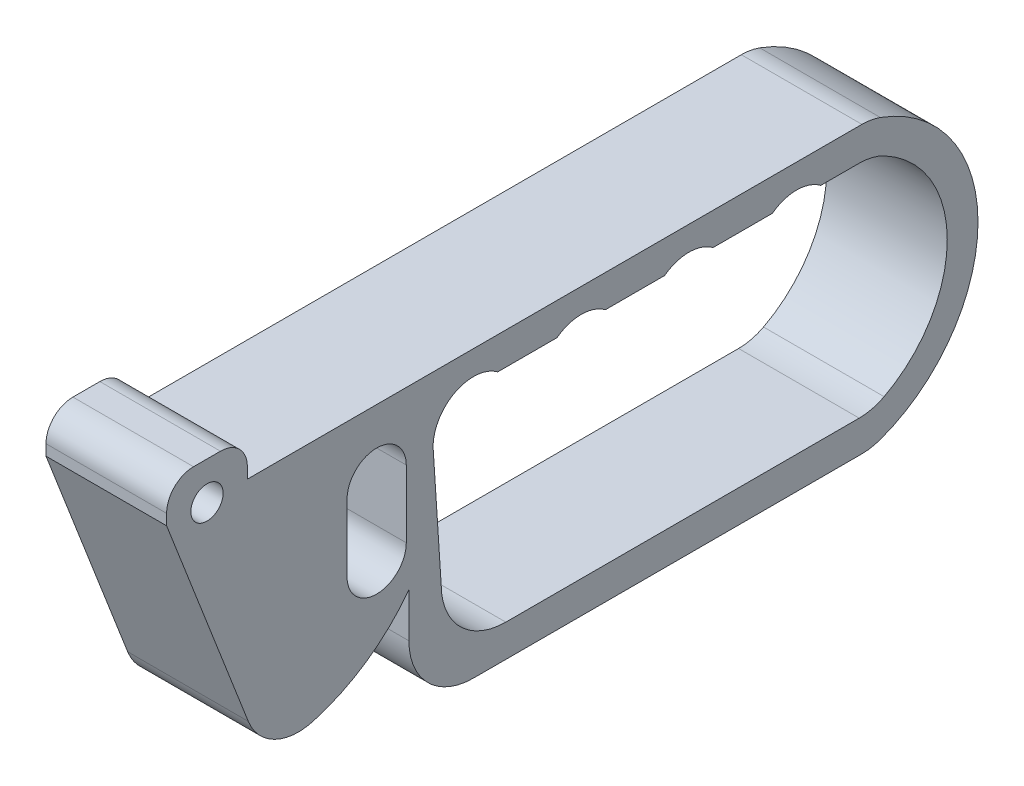
ISO-10303-21;
HEADER;
FILE_DESCRIPTION(('STEP AP214'),'2;1');
FILE_NAME('part.step','',(''),(''),'','','');
FILE_SCHEMA(('AUTOMOTIVE_DESIGN { 1 0 10303 214 1 1 1 1 }'));
ENDSEC;
DATA;
#1=APPLICATION_CONTEXT('core data for automotive mechanical design processes');
#2=APPLICATION_PROTOCOL_DEFINITION('international standard','automotive_design',2000,#1);
#3=PRODUCT_CONTEXT('',#1,'mechanical');
#4=PRODUCT('Part','Part','',(#3));
#5=PRODUCT_RELATED_PRODUCT_CATEGORY('part','',(#4));
#6=PRODUCT_DEFINITION_FORMATION('','',#4);
#7=PRODUCT_DEFINITION_CONTEXT('part definition',#1,'design');
#8=PRODUCT_DEFINITION('design','',#6,#7);
#9=PRODUCT_DEFINITION_SHAPE('','',#8);
#10=(LENGTH_UNIT() NAMED_UNIT(*) SI_UNIT(.MILLI.,.METRE.));
#11=(NAMED_UNIT(*) PLANE_ANGLE_UNIT() SI_UNIT($,.RADIAN.));
#12=(NAMED_UNIT(*) SI_UNIT($,.STERADIAN.) SOLID_ANGLE_UNIT());
#13=UNCERTAINTY_MEASURE_WITH_UNIT(LENGTH_MEASURE(1.E-05),#10,'distance_accuracy_value','');
#14=(GEOMETRIC_REPRESENTATION_CONTEXT(3) GLOBAL_UNCERTAINTY_ASSIGNED_CONTEXT((#13)) GLOBAL_UNIT_ASSIGNED_CONTEXT((#10,
#11,#12)) REPRESENTATION_CONTEXT('',''));
#15=CARTESIAN_POINT('',(0.,0.,0.));
#16=DIRECTION('',(0.,0.,1.));
#17=DIRECTION('',(1.,0.,0.));
#18=AXIS2_PLACEMENT_3D('',#15,#16,#17);
#19=CARTESIAN_POINT('',(-11.2,-14.5,40.85));
#20=DIRECTION('',(1.,0.,0.));
#21=DIRECTION('',(0.,0.,-1.));
#22=AXIS2_PLACEMENT_3D('',#19,#20,#21);
#23=PLANE('',#22);
#24=CARTESIAN_POINT('',(-11.2,26.5,90.35));
#25=DIRECTION('',(1.,0.,0.));
#26=DIRECTION('',(0.,0.,-1.));
#27=AXIS2_PLACEMENT_3D('',#24,#25,#26);
#28=CIRCLE('',#27,3.00000000000001);
#29=CARTESIAN_POINT('',(-11.2,26.5,87.35));
#30=VERTEX_POINT('',#29);
#31=EDGE_CURVE('E986',#30,#30,#28,.F.);
#32=ORIENTED_EDGE('',*,*,#31,.F.);
#33=EDGE_LOOP('',(#32));
#34=FACE_BOUND('',#33,.T.);
#35=DIRECTION('',(0.,0.997833989659183,0.0657824374802129));
#36=VECTOR('',#35,1.);
#37=CARTESIAN_POINT('',(-11.2,-8.50000000000008,46.85));
#38=LINE('',#37,#36);
#39=CARTESIAN_POINT('',(-11.2,-8.50000000000008,46.85));
#40=VERTEX_POINT('',#39);
#41=CARTESIAN_POINT('',(-11.2,14.0066317188984,48.3337549224439));
#42=VERTEX_POINT('',#41);
#43=EDGE_CURVE('E313',#40,#42,#38,.T.);
#44=ORIENTED_EDGE('',*,*,#43,.F.);
#45=CARTESIAN_POINT('',(-11.2,-8.5,34.85));
#46=DIRECTION('',(1.,0.,0.));
#47=DIRECTION('',(0.,0.,-1.));
#48=AXIS2_PLACEMENT_3D('',#45,#46,#47);
#49=CIRCLE('',#48,12.);
#50=CARTESIAN_POINT('',(-11.2,-20.5,34.8499999999999));
#51=VERTEX_POINT('',#50);
#52=EDGE_CURVE('E423',#40,#51,#49,.T.);
#53=ORIENTED_EDGE('',*,*,#52,.T.);
#54=DIRECTION('',(0.,0.,-1.));
#55=VECTOR('',#54,1.);
#56=CARTESIAN_POINT('',(-11.2,-20.5,34.8499999999999));
#57=LINE('',#56,#55);
#58=CARTESIAN_POINT('',(-11.2,-20.5,-30.7829674795884));
#59=VERTEX_POINT('',#58);
#60=EDGE_CURVE('E427',#51,#59,#57,.T.);
#61=ORIENTED_EDGE('',*,*,#60,.T.);
#62=CARTESIAN_POINT('',(-11.2,-10.5,-30.7829674795884));
#63=DIRECTION('',(1.,0.,0.));
#64=DIRECTION('',(0.,0.,-1.));
#65=AXIS2_PLACEMENT_3D('',#62,#63,#64);
#66=CIRCLE('',#65,10.);
#67=CARTESIAN_POINT('',(-11.2,-19.3620530720667,-35.4158947775149));
#68=VERTEX_POINT('',#67);
#69=EDGE_CURVE('E489',#59,#68,#66,.T.);
#70=ORIENTED_EDGE('',*,*,#69,.T.);
#71=CARTESIAN_POINT('',(-11.2,0.,-25.29375));
#72=DIRECTION('',(1.,0.,0.));
#73=DIRECTION('',(0.,0.,1.));
#74=AXIS2_PLACEMENT_3D('',#71,#72,#73);
#75=CIRCLE('',#74,21.8482702762141);
#76=CARTESIAN_POINT('',(-11.2,19.3620530720667,-35.4158947775149));
#77=VERTEX_POINT('',#76);
#78=EDGE_CURVE('E418',#68,#77,#75,.T.);
#79=ORIENTED_EDGE('',*,*,#78,.T.);
#80=CARTESIAN_POINT('',(-11.2,10.5,-30.7829674795884));
#81=DIRECTION('',(1.,0.,0.));
#82=DIRECTION('',(0.,0.,-1.));
#83=AXIS2_PLACEMENT_3D('',#80,#81,#82);
#84=CIRCLE('',#83,10.);
#85=CARTESIAN_POINT('',(-11.2,20.5,-30.7829674795884));
#86=VERTEX_POINT('',#85);
#87=EDGE_CURVE('E462',#77,#86,#84,.T.);
#88=ORIENTED_EDGE('',*,*,#87,.T.);
#89=DIRECTION('',(0.,0.,1.));
#90=VECTOR('',#89,1.);
#91=CARTESIAN_POINT('',(-11.2,20.5,-32.85));
#92=LINE('',#91,#90);
#93=CARTESIAN_POINT('',(-11.2,20.5,-23.65));
#94=VERTEX_POINT('',#93);
#95=EDGE_CURVE('E421',#86,#94,#92,.T.);
#96=ORIENTED_EDGE('',*,*,#95,.T.);
#97=CARTESIAN_POINT('',(-11.2,14.5,-19.15));
#98=DIRECTION('',(1.,0.,0.));
#99=DIRECTION('',(0.,0.,-1.));
#100=AXIS2_PLACEMENT_3D('',#97,#98,#99);
#101=CIRCLE('',#100,7.5);
#102=CARTESIAN_POINT('',(-11.2,20.5,-14.65));
#103=VERTEX_POINT('',#102);
#104=EDGE_CURVE('E352',#103,#94,#101,.F.);
#105=ORIENTED_EDGE('',*,*,#104,.F.);
#106=CARTESIAN_POINT('',(-11.2,20.5,-3.65));
#107=VERTEX_POINT('',#106);
#108=EDGE_CURVE('E424',#103,#107,#92,.T.);
#109=ORIENTED_EDGE('',*,*,#108,.T.);
#110=CARTESIAN_POINT('',(-11.2,14.5,0.84999999999999));
#111=DIRECTION('',(1.,0.,0.));
#112=DIRECTION('',(0.,0.,-1.));
#113=AXIS2_PLACEMENT_3D('',#110,#111,#112);
#114=CIRCLE('',#113,7.5);
#115=CARTESIAN_POINT('',(-11.2,20.5,5.34999999999998));
#116=VERTEX_POINT('',#115);
#117=EDGE_CURVE('E366',#116,#107,#114,.F.);
#118=ORIENTED_EDGE('',*,*,#117,.F.);
#119=CARTESIAN_POINT('',(-11.2,20.5,16.35));
#120=VERTEX_POINT('',#119);
#121=EDGE_CURVE('E682',#116,#120,#92,.T.);
#122=ORIENTED_EDGE('',*,*,#121,.T.);
#123=CARTESIAN_POINT('',(-11.2,14.5,20.85));
#124=DIRECTION('',(1.,0.,0.));
#125=DIRECTION('',(0.,0.,-1.));
#126=AXIS2_PLACEMENT_3D('',#123,#124,#125);
#127=CIRCLE('',#126,7.5);
#128=CARTESIAN_POINT('',(-11.2,20.5,25.35));
#129=VERTEX_POINT('',#128);
#130=EDGE_CURVE('E362',#129,#120,#127,.F.);
#131=ORIENTED_EDGE('',*,*,#130,.F.);
#132=CARTESIAN_POINT('',(-11.2,20.5,36.35));
#133=VERTEX_POINT('',#132);
#134=EDGE_CURVE('E420',#129,#133,#92,.T.);
#135=ORIENTED_EDGE('',*,*,#134,.T.);
#136=CARTESIAN_POINT('',(-11.2,14.5,40.85));
#137=DIRECTION('',(1.,0.,0.));
#138=DIRECTION('',(0.,0.,-1.));
#139=AXIS2_PLACEMENT_3D('',#136,#137,#138);
#140=CIRCLE('',#139,7.5);
#141=EDGE_CURVE('E358',#42,#133,#140,.F.);
#142=ORIENTED_EDGE('',*,*,#141,.F.);
#143=EDGE_LOOP('',(#44,#53,#61,#70,#79,#88,#96,#105,#109,#118,#122,#131,#135,#142));
#144=FACE_BOUND('',#143,.T.);
#145=CARTESIAN_POINT('',(-11.2,13.8770572321374,79.85));
#146=DIRECTION('',(1.,0.,0.));
#147=DIRECTION('',(0.,0.,-1.));
#148=AXIS2_PLACEMENT_3D('',#145,#146,#147);
#149=CIRCLE('',#148,33.7062848523677);
#150=CARTESIAN_POINT('',(-11.2,-6.3,52.85));
#151=VERTEX_POINT('',#150);
#152=CARTESIAN_POINT('',(-11.2,-18.5411037952664,70.6208898505726));
#153=VERTEX_POINT('',#152);
#154=EDGE_CURVE('E304',#151,#153,#149,.F.);
#155=ORIENTED_EDGE('',*,*,#154,.T.);
#156=CARTESIAN_POINT('',(-11.2,-8.92326511343182,73.3589875643523));
#157=DIRECTION('',(1.,0.,0.));
#158=DIRECTION('',(0.,0.,-1.));
#159=AXIS2_PLACEMENT_3D('',#156,#157,#158);
#160=CIRCLE('',#159,10.);
#161=CARTESIAN_POINT('',(-11.2,-12.5447702064899,82.6801838856918));
#162=VERTEX_POINT('',#161);
#163=EDGE_CURVE('E494',#153,#162,#160,.F.);
#164=ORIENTED_EDGE('',*,*,#163,.T.);
#165=DIRECTION('',(0.,0.932119632133956,0.362150509305811));
#166=VECTOR('',#165,1.);
#167=CARTESIAN_POINT('',(-11.2,-19.8292276202303,79.85));
#168=LINE('',#167,#166);
#169=CARTESIAN_POINT('',(-11.2,26.5,97.85));
#170=VERTEX_POINT('',#169);
#171=EDGE_CURVE('E302',#162,#170,#168,.T.);
#172=ORIENTED_EDGE('',*,*,#171,.T.);
#173=DIRECTION('',(0.,1.,0.));
#174=VECTOR('',#173,1.);
#175=CARTESIAN_POINT('',(-11.2,26.5,97.85));
#176=LINE('',#175,#174);
#177=CARTESIAN_POINT('',(-11.2,28.5,97.85));
#178=VERTEX_POINT('',#177);
#179=EDGE_CURVE('E299',#170,#178,#176,.T.);
#180=ORIENTED_EDGE('',*,*,#179,.T.);
#181=CARTESIAN_POINT('',(-11.2,28.5,92.85));
#182=DIRECTION('',(1.,0.,0.));
#183=DIRECTION('',(0.,0.,-1.));
#184=AXIS2_PLACEMENT_3D('',#181,#182,#183);
#185=CIRCLE('',#184,5.);
#186=CARTESIAN_POINT('',(-11.2,33.5,92.85));
#187=VERTEX_POINT('',#186);
#188=EDGE_CURVE('E296',#178,#187,#185,.F.);
#189=ORIENTED_EDGE('',*,*,#188,.T.);
#190=DIRECTION('',(0.,0.,-1.));
#191=VECTOR('',#190,1.);
#192=CARTESIAN_POINT('',(-11.2,33.5,92.85));
#193=LINE('',#192,#191);
#194=CARTESIAN_POINT('',(-11.2,33.5,87.85));
#195=VERTEX_POINT('',#194);
#196=EDGE_CURVE('E293',#187,#195,#193,.T.);
#197=ORIENTED_EDGE('',*,*,#196,.T.);
#198=CARTESIAN_POINT('',(-11.2,28.5,87.85));
#199=DIRECTION('',(1.,0.,0.));
#200=DIRECTION('',(0.,0.,-1.));
#201=AXIS2_PLACEMENT_3D('',#198,#199,#200);
#202=CIRCLE('',#201,5.);
#203=CARTESIAN_POINT('',(-11.2,28.5,82.85));
#204=VERTEX_POINT('',#203);
#205=EDGE_CURVE('E281',#195,#204,#202,.F.);
#206=ORIENTED_EDGE('',*,*,#205,.T.);
#207=DIRECTION('',(0.,-1.,0.));
#208=VECTOR('',#207,1.);
#209=CARTESIAN_POINT('',(-11.2,26.5,82.85));
#210=LINE('',#209,#208);
#211=CARTESIAN_POINT('',(-11.2,26.5,82.85));
#212=VERTEX_POINT('',#211);
#213=EDGE_CURVE('E307',#204,#212,#210,.T.);
#214=ORIENTED_EDGE('',*,*,#213,.T.);
#215=DIRECTION('',(0.,0.,1.));
#216=VECTOR('',#215,1.);
#217=CARTESIAN_POINT('',(-11.2,26.5,52.85));
#218=LINE('',#217,#216);
#219=CARTESIAN_POINT('',(-11.2,26.5,-31.2914090485372));
#220=VERTEX_POINT('',#219);
#221=EDGE_CURVE('E446',#220,#212,#218,.T.);
#222=ORIENTED_EDGE('',*,*,#221,.F.);
#223=CARTESIAN_POINT('',(-11.2,16.5,-31.2914090485372));
#224=DIRECTION('',(1.,0.,0.));
#225=DIRECTION('',(0.,0.,-1.));
#226=AXIS2_PLACEMENT_3D('',#223,#224,#225);
#227=CIRCLE('',#226,10.);
#228=CARTESIAN_POINT('',(-11.2,25.8983624065504,-34.7076619775723));
#229=VERTEX_POINT('',#228);
#230=EDGE_CURVE('E481',#220,#229,#227,.F.);
#231=ORIENTED_EDGE('',*,*,#230,.T.);
#232=CARTESIAN_POINT('',(-11.2,0.,-25.29375));
#233=DIRECTION('',(1.,0.,0.));
#234=DIRECTION('',(0.,0.,1.));
#235=AXIS2_PLACEMENT_3D('',#232,#233,#234);
#236=CIRCLE('',#235,27.55625);
#237=CARTESIAN_POINT('',(-11.2,-25.8983624065504,-34.7076619775723));
#238=VERTEX_POINT('',#237);
#239=EDGE_CURVE('E443',#238,#229,#236,.T.);
#240=ORIENTED_EDGE('',*,*,#239,.F.);
#241=CARTESIAN_POINT('',(-11.2,-16.5,-31.2914090485372));
#242=DIRECTION('',(1.,0.,0.));
#243=DIRECTION('',(0.,0.,-1.));
#244=AXIS2_PLACEMENT_3D('',#241,#242,#243);
#245=CIRCLE('',#244,10.);
#246=CARTESIAN_POINT('',(-11.2,-26.5,-31.2914090485372));
#247=VERTEX_POINT('',#246);
#248=EDGE_CURVE('E483',#238,#247,#245,.F.);
#249=ORIENTED_EDGE('',*,*,#248,.T.);
#250=DIRECTION('',(0.,0.,-1.));
#251=VECTOR('',#250,1.);
#252=CARTESIAN_POINT('',(-11.2,-26.5,40.8499999999999));
#253=LINE('',#252,#251);
#254=CARTESIAN_POINT('',(-11.2,-26.5,40.8499999999999));
#255=VERTEX_POINT('',#254);
#256=EDGE_CURVE('E440',#255,#247,#253,.T.);
#257=ORIENTED_EDGE('',*,*,#256,.F.);
#258=CARTESIAN_POINT('',(-11.2,-14.5,40.85));
#259=DIRECTION('',(1.,0.,0.));
#260=DIRECTION('',(0.,0.,-1.));
#261=AXIS2_PLACEMENT_3D('',#258,#259,#260);
#262=CIRCLE('',#261,12.);
#263=CARTESIAN_POINT('',(-11.2,-14.4999999999999,52.85));
#264=VERTEX_POINT('',#263);
#265=EDGE_CURVE('E437',#264,#255,#262,.T.);
#266=ORIENTED_EDGE('',*,*,#265,.F.);
#267=DIRECTION('',(0.,-1.,0.));
#268=VECTOR('',#267,1.);
#269=CARTESIAN_POINT('',(-11.2,26.5,52.85));
#270=LINE('',#269,#268);
#271=EDGE_CURVE('E433',#151,#264,#270,.T.);
#272=ORIENTED_EDGE('',*,*,#271,.F.);
#273=EDGE_LOOP('',(#155,#164,#172,#180,#189,#197,#206,#214,#222,#231,#240,#249,#257,#266,#272));
#274=FACE_BOUND('',#273,.T.);
#275=CARTESIAN_POINT('',(-11.2,14.0066317188984,58.8337549224439));
#276=DIRECTION('',(1.,0.,0.));
#277=DIRECTION('',(0.,0.,-1.));
#278=AXIS2_PLACEMENT_3D('',#275,#276,#277);
#279=CIRCLE('',#278,5.5);
#280=CARTESIAN_POINT('',(-11.2,14.0066317188984,64.3337549224438));
#281=VERTEX_POINT('',#280);
#282=CARTESIAN_POINT('',(-11.2,14.0066317188984,53.3337549224439));
#283=VERTEX_POINT('',#282);
#284=EDGE_CURVE('E56',#281,#283,#279,.F.);
#285=ORIENTED_EDGE('',*,*,#284,.F.);
#286=DIRECTION('',(0.,1.,0.));
#287=VECTOR('',#286,1.);
#288=CARTESIAN_POINT('',(-11.2,14.0066317188984,64.3337549224438));
#289=LINE('',#288,#287);
#290=CARTESIAN_POINT('',(-11.2,1.50663171889838,64.3337549224438));
#291=VERTEX_POINT('',#290);
#292=EDGE_CURVE('E259',#291,#281,#289,.T.);
#293=ORIENTED_EDGE('',*,*,#292,.F.);
#294=CARTESIAN_POINT('',(-11.2,1.50663171889838,58.8337549224439));
#295=DIRECTION('',(1.,0.,0.));
#296=DIRECTION('',(0.,0.,-1.));
#297=AXIS2_PLACEMENT_3D('',#294,#295,#296);
#298=CIRCLE('',#297,5.5);
#299=CARTESIAN_POINT('',(-11.2,1.50663171889838,53.3337549224439));
#300=VERTEX_POINT('',#299);
#301=EDGE_CURVE('E266',#300,#291,#298,.F.);
#302=ORIENTED_EDGE('',*,*,#301,.F.);
#303=DIRECTION('',(0.,-1.,0.));
#304=VECTOR('',#303,1.);
#305=CARTESIAN_POINT('',(-11.2,14.0066317188984,53.3337549224439));
#306=LINE('',#305,#304);
#307=EDGE_CURVE('E271',#283,#300,#306,.T.);
#308=ORIENTED_EDGE('',*,*,#307,.F.);
#309=EDGE_LOOP('',(#285,#293,#302,#308));
#310=FACE_BOUND('',#309,.T.);
#311=ADVANCED_FACE('F41',(#34,#144,#274,#310),#23,.F.);
#312=CARTESIAN_POINT('',(11.2,-14.5,40.85));
#313=DIRECTION('',(1.,0.,0.));
#314=DIRECTION('',(0.,0.,-1.));
#315=AXIS2_PLACEMENT_3D('',#312,#313,#314);
#316=PLANE('',#315);
#317=CARTESIAN_POINT('',(11.2,26.5,90.35));
#318=DIRECTION('',(1.,0.,0.));
#319=DIRECTION('',(0.,0.,-1.));
#320=AXIS2_PLACEMENT_3D('',#317,#318,#319);
#321=CIRCLE('',#320,3.00000000000001);
#322=CARTESIAN_POINT('',(11.2,26.5,87.35));
#323=VERTEX_POINT('',#322);
#324=EDGE_CURVE('E272',#323,#323,#321,.T.);
#325=ORIENTED_EDGE('',*,*,#324,.F.);
#326=EDGE_LOOP('',(#325));
#327=FACE_BOUND('',#326,.T.);
#328=DIRECTION('',(0.,-0.932119632133956,-0.362150509305811));
#329=VECTOR('',#328,1.);
#330=CARTESIAN_POINT('',(11.2,-19.8292276202303,79.85));
#331=LINE('',#330,#329);
#332=CARTESIAN_POINT('',(11.2,26.5,97.85));
#333=VERTEX_POINT('',#332);
#334=CARTESIAN_POINT('',(11.2,-12.5447702064899,82.6801838856918));
#335=VERTEX_POINT('',#334);
#336=EDGE_CURVE('E314',#333,#335,#331,.T.);
#337=ORIENTED_EDGE('',*,*,#336,.T.);
#338=CARTESIAN_POINT('',(11.2,-8.92326511343182,73.3589875643523));
#339=DIRECTION('',(1.,0.,0.));
#340=DIRECTION('',(0.,0.,-1.));
#341=AXIS2_PLACEMENT_3D('',#338,#339,#340);
#342=CIRCLE('',#341,10.);
#343=CARTESIAN_POINT('',(11.2,-18.5411037952664,70.6208898505726));
#344=VERTEX_POINT('',#343);
#345=EDGE_CURVE('E11',#335,#344,#342,.T.);
#346=ORIENTED_EDGE('',*,*,#345,.T.);
#347=CARTESIAN_POINT('',(11.2,13.8770572321374,79.85));
#348=DIRECTION('',(1.,0.,0.));
#349=DIRECTION('',(0.,0.,-1.));
#350=AXIS2_PLACEMENT_3D('',#347,#348,#349);
#351=CIRCLE('',#350,33.7062848523677);
#352=CARTESIAN_POINT('',(11.2,-6.3,52.85));
#353=VERTEX_POINT('',#352);
#354=EDGE_CURVE('E311',#344,#353,#351,.T.);
#355=ORIENTED_EDGE('',*,*,#354,.T.);
#356=DIRECTION('',(0.,-1.,0.));
#357=VECTOR('',#356,1.);
#358=CARTESIAN_POINT('',(11.2,26.5,52.85));
#359=LINE('',#358,#357);
#360=CARTESIAN_POINT('',(11.2,-14.4999999999999,52.85));
#361=VERTEX_POINT('',#360);
#362=EDGE_CURVE('E405',#353,#361,#359,.T.);
#363=ORIENTED_EDGE('',*,*,#362,.T.);
#364=CARTESIAN_POINT('',(11.2,-14.5,40.85));
#365=DIRECTION('',(1.,0.,0.));
#366=DIRECTION('',(0.,0.,-1.));
#367=AXIS2_PLACEMENT_3D('',#364,#365,#366);
#368=CIRCLE('',#367,12.);
#369=CARTESIAN_POINT('',(11.2,-26.5,40.8499999999999));
#370=VERTEX_POINT('',#369);
#371=EDGE_CURVE('E407',#361,#370,#368,.T.);
#372=ORIENTED_EDGE('',*,*,#371,.T.);
#373=DIRECTION('',(0.,0.,-1.));
#374=VECTOR('',#373,1.);
#375=CARTESIAN_POINT('',(11.2,-26.5,40.8499999999999));
#376=LINE('',#375,#374);
#377=CARTESIAN_POINT('',(11.2,-26.5,-31.2914090485372));
#378=VERTEX_POINT('',#377);
#379=EDGE_CURVE('E410',#370,#378,#376,.T.);
#380=ORIENTED_EDGE('',*,*,#379,.T.);
#381=CARTESIAN_POINT('',(11.2,-16.5,-31.2914090485372));
#382=DIRECTION('',(1.,0.,0.));
#383=DIRECTION('',(0.,0.,-1.));
#384=AXIS2_PLACEMENT_3D('',#381,#382,#383);
#385=CIRCLE('',#384,10.);
#386=CARTESIAN_POINT('',(11.2,-25.8983624065504,-34.7076619775723));
#387=VERTEX_POINT('',#386);
#388=EDGE_CURVE('E474',#378,#387,#385,.T.);
#389=ORIENTED_EDGE('',*,*,#388,.T.);
#390=CARTESIAN_POINT('',(11.2,0.,-25.29375));
#391=DIRECTION('',(1.,0.,0.));
#392=DIRECTION('',(0.,0.,1.));
#393=AXIS2_PLACEMENT_3D('',#390,#391,#392);
#394=CIRCLE('',#393,27.55625);
#395=CARTESIAN_POINT('',(11.2,25.8983624065504,-34.7076619775723));
#396=VERTEX_POINT('',#395);
#397=EDGE_CURVE('E413',#387,#396,#394,.T.);
#398=ORIENTED_EDGE('',*,*,#397,.T.);
#399=CARTESIAN_POINT('',(11.2,16.5,-31.2914090485372));
#400=DIRECTION('',(1.,0.,0.));
#401=DIRECTION('',(0.,0.,-1.));
#402=AXIS2_PLACEMENT_3D('',#399,#400,#401);
#403=CIRCLE('',#402,10.);
#404=CARTESIAN_POINT('',(11.2,26.5,-31.2914090485372));
#405=VERTEX_POINT('',#404);
#406=EDGE_CURVE('E472',#396,#405,#403,.T.);
#407=ORIENTED_EDGE('',*,*,#406,.T.);
#408=DIRECTION('',(0.,0.,1.));
#409=VECTOR('',#408,1.);
#410=CARTESIAN_POINT('',(11.2,26.5,52.85));
#411=LINE('',#410,#409);
#412=CARTESIAN_POINT('',(11.2,26.5,82.85));
#413=VERTEX_POINT('',#412);
#414=EDGE_CURVE('E416',#405,#413,#411,.T.);
#415=ORIENTED_EDGE('',*,*,#414,.T.);
#416=DIRECTION('',(0.,1.,0.));
#417=VECTOR('',#416,1.);
#418=CARTESIAN_POINT('',(11.2,26.5,82.85));
#419=LINE('',#418,#417);
#420=CARTESIAN_POINT('',(11.2,28.5,82.85));
#421=VERTEX_POINT('',#420);
#422=EDGE_CURVE('E329',#413,#421,#419,.T.);
#423=ORIENTED_EDGE('',*,*,#422,.T.);
#424=CARTESIAN_POINT('',(11.2,28.5,87.85));
#425=DIRECTION('',(1.,0.,0.));
#426=DIRECTION('',(0.,0.,-1.));
#427=AXIS2_PLACEMENT_3D('',#424,#425,#426);
#428=CIRCLE('',#427,5.);
#429=CARTESIAN_POINT('',(11.2,33.5,87.85));
#430=VERTEX_POINT('',#429);
#431=EDGE_CURVE('E326',#421,#430,#428,.T.);
#432=ORIENTED_EDGE('',*,*,#431,.T.);
#433=DIRECTION('',(0.,0.,1.));
#434=VECTOR('',#433,1.);
#435=CARTESIAN_POINT('',(11.2,33.5,92.85));
#436=LINE('',#435,#434);
#437=CARTESIAN_POINT('',(11.2,33.5,92.85));
#438=VERTEX_POINT('',#437);
#439=EDGE_CURVE('E323',#430,#438,#436,.T.);
#440=ORIENTED_EDGE('',*,*,#439,.T.);
#441=CARTESIAN_POINT('',(11.2,28.5,92.85));
#442=DIRECTION('',(1.,0.,0.));
#443=DIRECTION('',(0.,0.,-1.));
#444=AXIS2_PLACEMENT_3D('',#441,#442,#443);
#445=CIRCLE('',#444,5.);
#446=CARTESIAN_POINT('',(11.2,28.5,97.85));
#447=VERTEX_POINT('',#446);
#448=EDGE_CURVE('E320',#438,#447,#445,.T.);
#449=ORIENTED_EDGE('',*,*,#448,.T.);
#450=DIRECTION('',(0.,-1.,0.));
#451=VECTOR('',#450,1.);
#452=CARTESIAN_POINT('',(11.2,26.5,97.85));
#453=LINE('',#452,#451);
#454=EDGE_CURVE('E317',#447,#333,#453,.T.);
#455=ORIENTED_EDGE('',*,*,#454,.T.);
#456=EDGE_LOOP('',(#337,#346,#355,#363,#372,#380,#389,#398,#407,#415,#423,#432,#440,#449,#455));
#457=FACE_BOUND('',#456,.T.);
#458=CARTESIAN_POINT('',(11.2,-8.5,34.85));
#459=DIRECTION('',(1.,0.,0.));
#460=DIRECTION('',(0.,0.,-1.));
#461=AXIS2_PLACEMENT_3D('',#458,#459,#460);
#462=CIRCLE('',#461,12.);
#463=CARTESIAN_POINT('',(11.2,-8.50000000000008,46.85));
#464=VERTEX_POINT('',#463);
#465=CARTESIAN_POINT('',(11.2,-20.5,34.8499999999999));
#466=VERTEX_POINT('',#465);
#467=EDGE_CURVE('E398',#464,#466,#462,.T.);
#468=ORIENTED_EDGE('',*,*,#467,.F.);
#469=DIRECTION('',(0.,-0.997833989659183,-0.0657824374802129));
#470=VECTOR('',#469,1.);
#471=CARTESIAN_POINT('',(11.2,-8.50000000000008,46.85));
#472=LINE('',#471,#470);
#473=CARTESIAN_POINT('',(11.2,14.0066317188984,48.3337549224439));
#474=VERTEX_POINT('',#473);
#475=EDGE_CURVE('E350',#474,#464,#472,.T.);
#476=ORIENTED_EDGE('',*,*,#475,.F.);
#477=CARTESIAN_POINT('',(11.2,14.5,40.85));
#478=DIRECTION('',(1.,0.,0.));
#479=DIRECTION('',(0.,0.,-1.));
#480=AXIS2_PLACEMENT_3D('',#477,#478,#479);
#481=CIRCLE('',#480,7.5);
#482=CARTESIAN_POINT('',(11.2,20.5,36.35));
#483=VERTEX_POINT('',#482);
#484=EDGE_CURVE('E355',#483,#474,#481,.T.);
#485=ORIENTED_EDGE('',*,*,#484,.F.);
#486=DIRECTION('',(0.,0.,1.));
#487=VECTOR('',#486,1.);
#488=CARTESIAN_POINT('',(11.2,20.5,-32.85));
#489=LINE('',#488,#487);
#490=CARTESIAN_POINT('',(11.2,20.5,25.35));
#491=VERTEX_POINT('',#490);
#492=EDGE_CURVE('E395',#491,#483,#489,.T.);
#493=ORIENTED_EDGE('',*,*,#492,.F.);
#494=CARTESIAN_POINT('',(11.2,14.5,20.85));
#495=DIRECTION('',(1.,0.,0.));
#496=DIRECTION('',(0.,0.,-1.));
#497=AXIS2_PLACEMENT_3D('',#494,#495,#496);
#498=CIRCLE('',#497,7.5);
#499=CARTESIAN_POINT('',(11.2,20.5,16.35));
#500=VERTEX_POINT('',#499);
#501=EDGE_CURVE('E359',#500,#491,#498,.T.);
#502=ORIENTED_EDGE('',*,*,#501,.F.);
#503=CARTESIAN_POINT('',(11.2,20.5,5.34999999999998));
#504=VERTEX_POINT('',#503);
#505=EDGE_CURVE('E665',#504,#500,#489,.T.);
#506=ORIENTED_EDGE('',*,*,#505,.F.);
#507=CARTESIAN_POINT('',(11.2,14.5,0.84999999999999));
#508=DIRECTION('',(1.,0.,0.));
#509=DIRECTION('',(0.,0.,-1.));
#510=AXIS2_PLACEMENT_3D('',#507,#508,#509);
#511=CIRCLE('',#510,7.5);
#512=CARTESIAN_POINT('',(11.2,20.5,-3.65));
#513=VERTEX_POINT('',#512);
#514=EDGE_CURVE('E364',#513,#504,#511,.T.);
#515=ORIENTED_EDGE('',*,*,#514,.F.);
#516=CARTESIAN_POINT('',(11.2,20.5,-14.65));
#517=VERTEX_POINT('',#516);
#518=EDGE_CURVE('E399',#517,#513,#489,.T.);
#519=ORIENTED_EDGE('',*,*,#518,.F.);
#520=CARTESIAN_POINT('',(11.2,14.5,-19.15));
#521=DIRECTION('',(1.,0.,0.));
#522=DIRECTION('',(0.,0.,-1.));
#523=AXIS2_PLACEMENT_3D('',#520,#521,#522);
#524=CIRCLE('',#523,7.5);
#525=CARTESIAN_POINT('',(11.2,20.5,-23.65));
#526=VERTEX_POINT('',#525);
#527=EDGE_CURVE('E368',#526,#517,#524,.T.);
#528=ORIENTED_EDGE('',*,*,#527,.F.);
#529=CARTESIAN_POINT('',(11.2,20.5,-30.7829674795884));
#530=VERTEX_POINT('',#529);
#531=EDGE_CURVE('E396',#530,#526,#489,.T.);
#532=ORIENTED_EDGE('',*,*,#531,.F.);
#533=CARTESIAN_POINT('',(11.2,10.5,-30.7829674795884));
#534=DIRECTION('',(1.,0.,0.));
#535=DIRECTION('',(0.,0.,-1.));
#536=AXIS2_PLACEMENT_3D('',#533,#534,#535);
#537=CIRCLE('',#536,10.);
#538=CARTESIAN_POINT('',(11.2,19.3620530720667,-35.4158947775149));
#539=VERTEX_POINT('',#538);
#540=EDGE_CURVE('E459',#530,#539,#537,.F.);
#541=ORIENTED_EDGE('',*,*,#540,.T.);
#542=CARTESIAN_POINT('',(11.2,0.,-25.29375));
#543=DIRECTION('',(1.,0.,0.));
#544=DIRECTION('',(0.,0.,1.));
#545=AXIS2_PLACEMENT_3D('',#542,#543,#544);
#546=CIRCLE('',#545,21.8482702762141);
#547=CARTESIAN_POINT('',(11.2,-19.3620530720667,-35.4158947775149));
#548=VERTEX_POINT('',#547);
#549=EDGE_CURVE('E393',#548,#539,#546,.T.);
#550=ORIENTED_EDGE('',*,*,#549,.F.);
#551=CARTESIAN_POINT('',(11.2,-10.5,-30.7829674795884));
#552=DIRECTION('',(1.,0.,0.));
#553=DIRECTION('',(0.,0.,-1.));
#554=AXIS2_PLACEMENT_3D('',#551,#552,#553);
#555=CIRCLE('',#554,10.);
#556=CARTESIAN_POINT('',(11.2,-20.5,-30.7829674795884));
#557=VERTEX_POINT('',#556);
#558=EDGE_CURVE('E487',#548,#557,#555,.F.);
#559=ORIENTED_EDGE('',*,*,#558,.T.);
#560=DIRECTION('',(0.,0.,-1.));
#561=VECTOR('',#560,1.);
#562=CARTESIAN_POINT('',(11.2,-20.5,34.8499999999999));
#563=LINE('',#562,#561);
#564=EDGE_CURVE('E402',#466,#557,#563,.T.);
#565=ORIENTED_EDGE('',*,*,#564,.F.);
#566=EDGE_LOOP('',(#468,#476,#485,#493,#502,#506,#515,#519,#528,#532,#541,#550,#559,#565));
#567=FACE_BOUND('',#566,.T.);
#568=DIRECTION('',(0.,-1.,0.));
#569=VECTOR('',#568,1.);
#570=CARTESIAN_POINT('',(11.2,14.0066317188984,64.3337549224438));
#571=LINE('',#570,#569);
#572=CARTESIAN_POINT('',(11.2,14.0066317188984,64.3337549224438));
#573=VERTEX_POINT('',#572);
#574=CARTESIAN_POINT('',(11.2,1.50663171889838,64.3337549224438));
#575=VERTEX_POINT('',#574);
#576=EDGE_CURVE('E261',#573,#575,#571,.T.);
#577=ORIENTED_EDGE('',*,*,#576,.F.);
#578=CARTESIAN_POINT('',(11.2,14.0066317188984,58.8337549224439));
#579=DIRECTION('',(1.,0.,0.));
#580=DIRECTION('',(0.,0.,-1.));
#581=AXIS2_PLACEMENT_3D('',#578,#579,#580);
#582=CIRCLE('',#581,5.5);
#583=CARTESIAN_POINT('',(11.2,14.0066317188984,53.3337549224439));
#584=VERTEX_POINT('',#583);
#585=EDGE_CURVE('E283',#584,#573,#582,.T.);
#586=ORIENTED_EDGE('',*,*,#585,.F.);
#587=DIRECTION('',(0.,1.,0.));
#588=VECTOR('',#587,1.);
#589=CARTESIAN_POINT('',(11.2,14.0066317188984,53.3337549224439));
#590=LINE('',#589,#588);
#591=CARTESIAN_POINT('',(11.2,1.50663171889838,53.3337549224438));
#592=VERTEX_POINT('',#591);
#593=EDGE_CURVE('E286',#592,#584,#590,.T.);
#594=ORIENTED_EDGE('',*,*,#593,.F.);
#595=CARTESIAN_POINT('',(11.2,1.50663171889838,58.8337549224439));
#596=DIRECTION('',(1.,0.,0.));
#597=DIRECTION('',(0.,0.,-1.));
#598=AXIS2_PLACEMENT_3D('',#595,#596,#597);
#599=CIRCLE('',#598,5.5);
#600=EDGE_CURVE('E64',#575,#592,#599,.T.);
#601=ORIENTED_EDGE('',*,*,#600,.F.);
#602=EDGE_LOOP('',(#577,#586,#594,#601));
#603=FACE_BOUND('',#602,.T.);
#604=ADVANCED_FACE('F503',(#327,#457,#567,#603),#316,.T.);
#605=CARTESIAN_POINT('',(-11.2,26.5,52.85));
#606=DIRECTION('',(0.,0.,1.));
#607=DIRECTION('',(1.,0.,0.));
#608=AXIS2_PLACEMENT_3D('',#605,#606,#607);
#609=PLANE('',#608);
#610=ORIENTED_EDGE('',*,*,#362,.F.);
#611=DIRECTION('',(-1.,0.,0.));
#612=VECTOR('',#611,1.);
#613=CARTESIAN_POINT('',(80.9782668068671,-6.3,52.85));
#614=LINE('',#613,#612);
#615=EDGE_CURVE('E332',#353,#151,#614,.T.);
#616=ORIENTED_EDGE('',*,*,#615,.T.);
#617=ORIENTED_EDGE('',*,*,#271,.T.);
#618=DIRECTION('',(1.,0.,0.));
#619=VECTOR('',#618,1.);
#620=CARTESIAN_POINT('',(-11.2,-14.4999999999999,52.85));
#621=LINE('',#620,#619);
#622=EDGE_CURVE('E448',#264,#361,#621,.T.);
#623=ORIENTED_EDGE('',*,*,#622,.T.);
#624=EDGE_LOOP('',(#610,#616,#617,#623));
#625=FACE_BOUND('',#624,.T.);
#626=ADVANCED_FACE('F517',(#625),#609,.T.);
#627=CARTESIAN_POINT('',(-11.2,20.5,-32.85));
#628=DIRECTION('',(0.,1.,0.));
#629=DIRECTION('',(0.,0.,1.));
#630=AXIS2_PLACEMENT_3D('',#627,#628,#629);
#631=PLANE('',#630);
#632=ORIENTED_EDGE('',*,*,#492,.T.);
#633=DIRECTION('',(1.,0.,0.));
#634=VECTOR('',#633,1.);
#635=CARTESIAN_POINT('',(-32.4132034355964,20.5,36.35));
#636=LINE('',#635,#634);
#637=EDGE_CURVE('E390',#483,#133,#636,.F.);
#638=ORIENTED_EDGE('',*,*,#637,.T.);
#639=ORIENTED_EDGE('',*,*,#134,.F.);
#640=DIRECTION('',(1.,0.,0.));
#641=VECTOR('',#640,1.);
#642=CARTESIAN_POINT('',(-32.4132034355964,20.5,25.35));
#643=LINE('',#642,#641);
#644=EDGE_CURVE('E387',#129,#491,#643,.T.);
#645=ORIENTED_EDGE('',*,*,#644,.T.);
#646=EDGE_LOOP('',(#632,#638,#639,#645));
#647=FACE_BOUND('',#646,.T.);
#648=ADVANCED_FACE('F596',(#647),#631,.F.);
#649=ORIENTED_EDGE('',*,*,#505,.T.);
#650=DIRECTION('',(1.,0.,0.));
#651=VECTOR('',#650,1.);
#652=CARTESIAN_POINT('',(-32.4132034355964,20.5,16.35));
#653=LINE('',#652,#651);
#654=EDGE_CURVE('E384',#500,#120,#653,.F.);
#655=ORIENTED_EDGE('',*,*,#654,.T.);
#656=ORIENTED_EDGE('',*,*,#121,.F.);
#657=DIRECTION('',(1.,0.,0.));
#658=VECTOR('',#657,1.);
#659=CARTESIAN_POINT('',(-32.4132034355964,20.5,5.34999999999998));
#660=LINE('',#659,#658);
#661=EDGE_CURVE('E381',#116,#504,#660,.T.);
#662=ORIENTED_EDGE('',*,*,#661,.T.);
#663=EDGE_LOOP('',(#649,#655,#656,#662));
#664=FACE_BOUND('',#663,.T.);
#665=ADVANCED_FACE('F651',(#664),#631,.F.);
#666=ORIENTED_EDGE('',*,*,#518,.T.);
#667=DIRECTION('',(1.,0.,0.));
#668=VECTOR('',#667,1.);
#669=CARTESIAN_POINT('',(-32.4132034355964,20.5,-3.65));
#670=LINE('',#669,#668);
#671=EDGE_CURVE('E378',#513,#107,#670,.F.);
#672=ORIENTED_EDGE('',*,*,#671,.T.);
#673=ORIENTED_EDGE('',*,*,#108,.F.);
#674=DIRECTION('',(1.,0.,0.));
#675=VECTOR('',#674,1.);
#676=CARTESIAN_POINT('',(-32.4132034355964,20.5,-14.65));
#677=LINE('',#676,#675);
#678=EDGE_CURVE('E375',#103,#517,#677,.T.);
#679=ORIENTED_EDGE('',*,*,#678,.T.);
#680=EDGE_LOOP('',(#666,#672,#673,#679));
#681=FACE_BOUND('',#680,.T.);
#682=ADVANCED_FACE('F587',(#681),#631,.F.);
#683=CARTESIAN_POINT('',(-11.2,26.5,52.85));
#684=DIRECTION('',(0.,1.,0.));
#685=DIRECTION('',(0.,0.,1.));
#686=AXIS2_PLACEMENT_3D('',#683,#684,#685);
#687=PLANE('',#686);
#688=ORIENTED_EDGE('',*,*,#414,.F.);
#689=DIRECTION('',(1.,0.,0.));
#690=VECTOR('',#689,1.);
#691=CARTESIAN_POINT('',(-11.2,26.5,-31.2914090485372));
#692=LINE('',#691,#690);
#693=EDGE_CURVE('E485',#405,#220,#692,.F.);
#694=ORIENTED_EDGE('',*,*,#693,.T.);
#695=ORIENTED_EDGE('',*,*,#221,.T.);
#696=DIRECTION('',(-1.,0.,0.));
#697=VECTOR('',#696,1.);
#698=CARTESIAN_POINT('',(80.9782668068671,26.5,82.85));
#699=LINE('',#698,#697);
#700=EDGE_CURVE('E310',#413,#212,#699,.T.);
#701=ORIENTED_EDGE('',*,*,#700,.F.);
#702=EDGE_LOOP('',(#688,#694,#695,#701));
#703=FACE_BOUND('',#702,.T.);
#704=ADVANCED_FACE('F542',(#703),#687,.T.);
#705=CARTESIAN_POINT('',(-11.2,0.,-25.29375));
#706=DIRECTION('',(1.,0.,0.));
#707=DIRECTION('',(0.,0.,-1.));
#708=AXIS2_PLACEMENT_3D('',#705,#706,#707);
#709=CYLINDRICAL_SURFACE('',#708,27.55625);
#710=ORIENTED_EDGE('',*,*,#397,.F.);
#711=DIRECTION('',(1.,0.,0.));
#712=VECTOR('',#711,1.);
#713=CARTESIAN_POINT('',(-11.2,-25.8983624065504,-34.7076619775723));
#714=LINE('',#713,#712);
#715=EDGE_CURVE('E479',#387,#238,#714,.F.);
#716=ORIENTED_EDGE('',*,*,#715,.T.);
#717=ORIENTED_EDGE('',*,*,#239,.T.);
#718=DIRECTION('',(1.,0.,0.));
#719=VECTOR('',#718,1.);
#720=CARTESIAN_POINT('',(-11.2,25.8983624065504,-34.7076619775723));
#721=LINE('',#720,#719);
#722=EDGE_CURVE('E476',#229,#396,#721,.T.);
#723=ORIENTED_EDGE('',*,*,#722,.T.);
#724=EDGE_LOOP('',(#710,#716,#717,#723));
#725=FACE_BOUND('',#724,.T.);
#726=ADVANCED_FACE('F531',(#725),#709,.T.);
#727=CARTESIAN_POINT('',(-11.2,-26.5,40.8499999999999));
#728=DIRECTION('',(0.,-1.,0.));
#729=DIRECTION('',(0.,0.,-1.));
#730=AXIS2_PLACEMENT_3D('',#727,#728,#729);
#731=PLANE('',#730);
#732=ORIENTED_EDGE('',*,*,#256,.T.);
#733=DIRECTION('',(1.,0.,0.));
#734=VECTOR('',#733,1.);
#735=CARTESIAN_POINT('',(-11.2,-26.5,-31.2914090485372));
#736=LINE('',#735,#734);
#737=EDGE_CURVE('E469',#247,#378,#736,.T.);
#738=ORIENTED_EDGE('',*,*,#737,.T.);
#739=ORIENTED_EDGE('',*,*,#379,.F.);
#740=DIRECTION('',(1.,0.,0.));
#741=VECTOR('',#740,1.);
#742=CARTESIAN_POINT('',(-11.2,-26.5,40.8499999999999));
#743=LINE('',#742,#741);
#744=EDGE_CURVE('E449',#255,#370,#743,.T.);
#745=ORIENTED_EDGE('',*,*,#744,.F.);
#746=EDGE_LOOP('',(#732,#738,#739,#745));
#747=FACE_BOUND('',#746,.T.);
#748=ADVANCED_FACE('F523',(#747),#731,.T.);
#749=CARTESIAN_POINT('',(-11.2,-14.5,40.85));
#750=DIRECTION('',(1.,0.,0.));
#751=DIRECTION('',(0.,0.,-1.));
#752=AXIS2_PLACEMENT_3D('',#749,#750,#751);
#753=CYLINDRICAL_SURFACE('',#752,12.);
#754=ORIENTED_EDGE('',*,*,#744,.T.);
#755=ORIENTED_EDGE('',*,*,#371,.F.);
#756=ORIENTED_EDGE('',*,*,#622,.F.);
#757=ORIENTED_EDGE('',*,*,#265,.T.);
#758=EDGE_LOOP('',(#754,#755,#756,#757));
#759=FACE_BOUND('',#758,.T.);
#760=ADVANCED_FACE('F520',(#759),#753,.T.);
#761=CARTESIAN_POINT('',(-11.2,0.,-25.29375));
#762=DIRECTION('',(1.,0.,0.));
#763=DIRECTION('',(0.,0.,-1.));
#764=AXIS2_PLACEMENT_3D('',#761,#762,#763);
#765=CYLINDRICAL_SURFACE('',#764,21.8482702762141);
#766=ORIENTED_EDGE('',*,*,#78,.F.);
#767=DIRECTION('',(1.,0.,0.));
#768=VECTOR('',#767,1.);
#769=CARTESIAN_POINT('',(-11.2,-19.3620530720667,-35.4158947775149));
#770=LINE('',#769,#768);
#771=EDGE_CURVE('E464',#68,#548,#770,.T.);
#772=ORIENTED_EDGE('',*,*,#771,.T.);
#773=ORIENTED_EDGE('',*,*,#549,.T.);
#774=DIRECTION('',(1.,0.,0.));
#775=VECTOR('',#774,1.);
#776=CARTESIAN_POINT('',(-11.2,19.3620530720667,-35.4158947775149));
#777=LINE('',#776,#775);
#778=EDGE_CURVE('E456',#539,#77,#777,.F.);
#779=ORIENTED_EDGE('',*,*,#778,.T.);
#780=EDGE_LOOP('',(#766,#772,#773,#779));
#781=FACE_BOUND('',#780,.T.);
#782=ADVANCED_FACE('F583',(#781),#765,.F.);
#783=CARTESIAN_POINT('',(-11.2,-20.5,34.8499999999999));
#784=DIRECTION('',(0.,-1.,0.));
#785=DIRECTION('',(0.,0.,-1.));
#786=AXIS2_PLACEMENT_3D('',#783,#784,#785);
#787=PLANE('',#786);
#788=ORIENTED_EDGE('',*,*,#564,.T.);
#789=DIRECTION('',(-1.,0.,0.));
#790=VECTOR('',#789,1.);
#791=CARTESIAN_POINT('',(-11.2,-20.5,-30.7829674795884));
#792=LINE('',#791,#790);
#793=EDGE_CURVE('E467',#557,#59,#792,.T.);
#794=ORIENTED_EDGE('',*,*,#793,.T.);
#795=ORIENTED_EDGE('',*,*,#60,.F.);
#796=DIRECTION('',(1.,0.,0.));
#797=VECTOR('',#796,1.);
#798=CARTESIAN_POINT('',(-11.2,-20.5,34.8499999999999));
#799=LINE('',#798,#797);
#800=EDGE_CURVE('E431',#51,#466,#799,.T.);
#801=ORIENTED_EDGE('',*,*,#800,.T.);
#802=EDGE_LOOP('',(#788,#794,#795,#801));
#803=FACE_BOUND('',#802,.T.);
#804=ADVANCED_FACE('F638',(#803),#787,.F.);
#805=CARTESIAN_POINT('',(-11.2,-8.5,34.85));
#806=DIRECTION('',(1.,0.,0.));
#807=DIRECTION('',(0.,0.,-1.));
#808=AXIS2_PLACEMENT_3D('',#805,#806,#807);
#809=CYLINDRICAL_SURFACE('',#808,12.);
#810=DIRECTION('',(1.,0.,0.));
#811=VECTOR('',#810,1.);
#812=CARTESIAN_POINT('',(-11.2,-8.49999999999991,46.85));
#813=LINE('',#812,#811);
#814=EDGE_CURVE('E430',#40,#464,#813,.T.);
#815=ORIENTED_EDGE('',*,*,#814,.T.);
#816=ORIENTED_EDGE('',*,*,#467,.T.);
#817=ORIENTED_EDGE('',*,*,#800,.F.);
#818=ORIENTED_EDGE('',*,*,#52,.F.);
#819=EDGE_LOOP('',(#815,#816,#817,#818));
#820=FACE_BOUND('',#819,.T.);
#821=ADVANCED_FACE('F641',(#820),#809,.F.);
#822=ORIENTED_EDGE('',*,*,#95,.F.);
#823=DIRECTION('',(-1.,0.,0.));
#824=VECTOR('',#823,1.);
#825=CARTESIAN_POINT('',(11.2,20.5,-30.7829674795884));
#826=LINE('',#825,#824);
#827=EDGE_CURVE('E451',#86,#530,#826,.F.);
#828=ORIENTED_EDGE('',*,*,#827,.T.);
#829=ORIENTED_EDGE('',*,*,#531,.T.);
#830=DIRECTION('',(1.,0.,0.));
#831=VECTOR('',#830,1.);
#832=CARTESIAN_POINT('',(-32.4132034355964,20.5,-23.65));
#833=LINE('',#832,#831);
#834=EDGE_CURVE('E361',#526,#94,#833,.F.);
#835=ORIENTED_EDGE('',*,*,#834,.T.);
#836=EDGE_LOOP('',(#822,#828,#829,#835));
#837=FACE_BOUND('',#836,.T.);
#838=ADVANCED_FACE('F635',(#837),#631,.F.);
#839=CARTESIAN_POINT('',(-32.4132034355964,14.5,-19.15));
#840=DIRECTION('',(1.,0.,0.));
#841=DIRECTION('',(0.,0.,-1.));
#842=AXIS2_PLACEMENT_3D('',#839,#840,#841);
#843=CYLINDRICAL_SURFACE('',#842,7.5);
#844=ORIENTED_EDGE('',*,*,#104,.T.);
#845=ORIENTED_EDGE('',*,*,#834,.F.);
#846=ORIENTED_EDGE('',*,*,#527,.T.);
#847=ORIENTED_EDGE('',*,*,#678,.F.);
#848=EDGE_LOOP('',(#844,#845,#846,#847));
#849=FACE_BOUND('',#848,.T.);
#850=ADVANCED_FACE('F632',(#849),#843,.F.);
#851=CARTESIAN_POINT('',(-32.4132034355964,14.5,0.84999999999999));
#852=DIRECTION('',(1.,0.,0.));
#853=DIRECTION('',(0.,0.,-1.));
#854=AXIS2_PLACEMENT_3D('',#851,#852,#853);
#855=CYLINDRICAL_SURFACE('',#854,7.5);
#856=ORIENTED_EDGE('',*,*,#117,.T.);
#857=ORIENTED_EDGE('',*,*,#671,.F.);
#858=ORIENTED_EDGE('',*,*,#514,.T.);
#859=ORIENTED_EDGE('',*,*,#661,.F.);
#860=EDGE_LOOP('',(#856,#857,#858,#859));
#861=FACE_BOUND('',#860,.T.);
#862=ADVANCED_FACE('F628',(#861),#855,.F.);
#863=CARTESIAN_POINT('',(-32.4132034355964,14.5,20.85));
#864=DIRECTION('',(1.,0.,0.));
#865=DIRECTION('',(0.,0.,-1.));
#866=AXIS2_PLACEMENT_3D('',#863,#864,#865);
#867=CYLINDRICAL_SURFACE('',#866,7.5);
#868=ORIENTED_EDGE('',*,*,#130,.T.);
#869=ORIENTED_EDGE('',*,*,#654,.F.);
#870=ORIENTED_EDGE('',*,*,#501,.T.);
#871=ORIENTED_EDGE('',*,*,#644,.F.);
#872=EDGE_LOOP('',(#868,#869,#870,#871));
#873=FACE_BOUND('',#872,.T.);
#874=ADVANCED_FACE('F624',(#873),#867,.F.);
#875=CARTESIAN_POINT('',(-32.4132034355964,14.5,40.85));
#876=DIRECTION('',(1.,0.,0.));
#877=DIRECTION('',(0.,0.,-1.));
#878=AXIS2_PLACEMENT_3D('',#875,#876,#877);
#879=CYLINDRICAL_SURFACE('',#878,7.5);
#880=ORIENTED_EDGE('',*,*,#484,.T.);
#881=DIRECTION('',(-1.,0.,0.));
#882=VECTOR('',#881,1.);
#883=CARTESIAN_POINT('',(33.75548713728,14.0066317188984,48.3337549224439));
#884=LINE('',#883,#882);
#885=EDGE_CURVE('E349',#474,#42,#884,.T.);
#886=ORIENTED_EDGE('',*,*,#885,.T.);
#887=ORIENTED_EDGE('',*,*,#141,.T.);
#888=ORIENTED_EDGE('',*,*,#637,.F.);
#889=EDGE_LOOP('',(#880,#886,#887,#888));
#890=FACE_BOUND('',#889,.T.);
#891=ADVANCED_FACE('F601',(#890),#879,.F.);
#892=CARTESIAN_POINT('',(-11.2,10.5,-30.7829674795884));
#893=DIRECTION('',(1.,0.,0.));
#894=DIRECTION('',(0.,0.,-1.));
#895=AXIS2_PLACEMENT_3D('',#892,#893,#894);
#896=CYLINDRICAL_SURFACE('',#895,10.);
#897=ORIENTED_EDGE('',*,*,#87,.F.);
#898=ORIENTED_EDGE('',*,*,#778,.F.);
#899=ORIENTED_EDGE('',*,*,#540,.F.);
#900=ORIENTED_EDGE('',*,*,#827,.F.);
#901=EDGE_LOOP('',(#897,#898,#899,#900));
#902=FACE_BOUND('',#901,.T.);
#903=ADVANCED_FACE('F597',(#902),#896,.F.);
#904=CARTESIAN_POINT('',(33.75548713728,-8.50000000000008,46.85));
#905=DIRECTION('',(0.,0.0657824374802129,-0.997833989659182));
#906=DIRECTION('',(0.,0.997833989659183,0.0657824374802129));
#907=AXIS2_PLACEMENT_3D('',#904,#905,#906);
#908=PLANE('',#907);
#909=ORIENTED_EDGE('',*,*,#475,.T.);
#910=ORIENTED_EDGE('',*,*,#814,.F.);
#911=ORIENTED_EDGE('',*,*,#43,.T.);
#912=ORIENTED_EDGE('',*,*,#885,.F.);
#913=EDGE_LOOP('',(#909,#910,#911,#912));
#914=FACE_BOUND('',#913,.T.);
#915=ADVANCED_FACE('F600',(#914),#908,.T.);
#916=CARTESIAN_POINT('',(-11.2,-10.5,-30.7829674795884));
#917=DIRECTION('',(1.,0.,0.));
#918=DIRECTION('',(0.,0.,-1.));
#919=AXIS2_PLACEMENT_3D('',#916,#917,#918);
#920=CYLINDRICAL_SURFACE('',#919,10.);
#921=ORIENTED_EDGE('',*,*,#69,.F.);
#922=ORIENTED_EDGE('',*,*,#793,.F.);
#923=ORIENTED_EDGE('',*,*,#558,.F.);
#924=ORIENTED_EDGE('',*,*,#771,.F.);
#925=EDGE_LOOP('',(#921,#922,#923,#924));
#926=FACE_BOUND('',#925,.T.);
#927=ADVANCED_FACE('F603',(#926),#920,.F.);
#928=CARTESIAN_POINT('',(-11.2,-16.5,-31.2914090485372));
#929=DIRECTION('',(1.,0.,0.));
#930=DIRECTION('',(0.,0.,-1.));
#931=AXIS2_PLACEMENT_3D('',#928,#929,#930);
#932=CYLINDRICAL_SURFACE('',#931,10.);
#933=ORIENTED_EDGE('',*,*,#248,.F.);
#934=ORIENTED_EDGE('',*,*,#715,.F.);
#935=ORIENTED_EDGE('',*,*,#388,.F.);
#936=ORIENTED_EDGE('',*,*,#737,.F.);
#937=EDGE_LOOP('',(#933,#934,#935,#936));
#938=FACE_BOUND('',#937,.T.);
#939=ADVANCED_FACE('F527',(#938),#932,.T.);
#940=CARTESIAN_POINT('',(-11.2,16.5,-31.2914090485372));
#941=DIRECTION('',(1.,0.,0.));
#942=DIRECTION('',(0.,0.,-1.));
#943=AXIS2_PLACEMENT_3D('',#940,#941,#942);
#944=CYLINDRICAL_SURFACE('',#943,10.);
#945=ORIENTED_EDGE('',*,*,#230,.F.);
#946=ORIENTED_EDGE('',*,*,#693,.F.);
#947=ORIENTED_EDGE('',*,*,#406,.F.);
#948=ORIENTED_EDGE('',*,*,#722,.F.);
#949=EDGE_LOOP('',(#945,#946,#947,#948));
#950=FACE_BOUND('',#949,.T.);
#951=ADVANCED_FACE('F536',(#950),#944,.T.);
#952=CARTESIAN_POINT('',(80.9782668068671,26.5,82.85));
#953=DIRECTION('',(0.,0.,1.));
#954=DIRECTION('',(1.,0.,0.));
#955=AXIS2_PLACEMENT_3D('',#952,#953,#954);
#956=PLANE('',#955);
#957=ORIENTED_EDGE('',*,*,#422,.F.);
#958=ORIENTED_EDGE('',*,*,#700,.T.);
#959=ORIENTED_EDGE('',*,*,#213,.F.);
#960=DIRECTION('',(-1.,0.,0.));
#961=VECTOR('',#960,1.);
#962=CARTESIAN_POINT('',(80.9782668068671,28.5,82.85));
#963=LINE('',#962,#961);
#964=EDGE_CURVE('E335',#421,#204,#963,.T.);
#965=ORIENTED_EDGE('',*,*,#964,.F.);
#966=EDGE_LOOP('',(#957,#958,#959,#965));
#967=FACE_BOUND('',#966,.T.);
#968=ADVANCED_FACE('F546',(#967),#956,.F.);
#969=CARTESIAN_POINT('',(80.9782668068671,28.5,87.85));
#970=DIRECTION('',(-1.,0.,0.));
#971=DIRECTION('',(0.,0.,1.));
#972=AXIS2_PLACEMENT_3D('',#969,#970,#971);
#973=CYLINDRICAL_SURFACE('',#972,5.);
#974=ORIENTED_EDGE('',*,*,#431,.F.);
#975=ORIENTED_EDGE('',*,*,#964,.T.);
#976=ORIENTED_EDGE('',*,*,#205,.F.);
#977=DIRECTION('',(-1.,0.,0.));
#978=VECTOR('',#977,1.);
#979=CARTESIAN_POINT('',(80.9782668068671,33.5,87.85));
#980=LINE('',#979,#978);
#981=EDGE_CURVE('E337',#430,#195,#980,.T.);
#982=ORIENTED_EDGE('',*,*,#981,.F.);
#983=EDGE_LOOP('',(#974,#975,#976,#982));
#984=FACE_BOUND('',#983,.T.);
#985=ADVANCED_FACE('F552',(#984),#973,.T.);
#986=CARTESIAN_POINT('',(80.9782668068671,33.5,92.85));
#987=DIRECTION('',(0.,-1.,0.));
#988=DIRECTION('',(0.,0.,-1.));
#989=AXIS2_PLACEMENT_3D('',#986,#987,#988);
#990=PLANE('',#989);
#991=ORIENTED_EDGE('',*,*,#439,.F.);
#992=ORIENTED_EDGE('',*,*,#981,.T.);
#993=ORIENTED_EDGE('',*,*,#196,.F.);
#994=DIRECTION('',(-1.,0.,0.));
#995=VECTOR('',#994,1.);
#996=CARTESIAN_POINT('',(80.9782668068671,33.5,92.85));
#997=LINE('',#996,#995);
#998=EDGE_CURVE('E339',#438,#187,#997,.T.);
#999=ORIENTED_EDGE('',*,*,#998,.F.);
#1000=EDGE_LOOP('',(#991,#992,#993,#999));
#1001=FACE_BOUND('',#1000,.T.);
#1002=ADVANCED_FACE('F555',(#1001),#990,.F.);
#1003=CARTESIAN_POINT('',(80.9782668068671,28.5,92.85));
#1004=DIRECTION('',(-1.,0.,0.));
#1005=DIRECTION('',(0.,0.,1.));
#1006=AXIS2_PLACEMENT_3D('',#1003,#1004,#1005);
#1007=CYLINDRICAL_SURFACE('',#1006,5.);
#1008=ORIENTED_EDGE('',*,*,#448,.F.);
#1009=ORIENTED_EDGE('',*,*,#998,.T.);
#1010=ORIENTED_EDGE('',*,*,#188,.F.);
#1011=DIRECTION('',(-1.,0.,0.));
#1012=VECTOR('',#1011,1.);
#1013=CARTESIAN_POINT('',(80.9782668068671,28.5,97.85));
#1014=LINE('',#1013,#1012);
#1015=EDGE_CURVE('E341',#447,#178,#1014,.T.);
#1016=ORIENTED_EDGE('',*,*,#1015,.F.);
#1017=EDGE_LOOP('',(#1008,#1009,#1010,#1016));
#1018=FACE_BOUND('',#1017,.T.);
#1019=ADVANCED_FACE('F558',(#1018),#1007,.T.);
#1020=CARTESIAN_POINT('',(80.9782668068671,26.5,97.85));
#1021=DIRECTION('',(0.,0.,-1.));
#1022=DIRECTION('',(-1.,0.,0.));
#1023=AXIS2_PLACEMENT_3D('',#1020,#1021,#1022);
#1024=PLANE('',#1023);
#1025=ORIENTED_EDGE('',*,*,#454,.F.);
#1026=ORIENTED_EDGE('',*,*,#1015,.T.);
#1027=ORIENTED_EDGE('',*,*,#179,.F.);
#1028=DIRECTION('',(-1.,0.,0.));
#1029=VECTOR('',#1028,1.);
#1030=CARTESIAN_POINT('',(80.9782668068671,26.5,97.85));
#1031=LINE('',#1030,#1029);
#1032=EDGE_CURVE('E343',#333,#170,#1031,.T.);
#1033=ORIENTED_EDGE('',*,*,#1032,.F.);
#1034=EDGE_LOOP('',(#1025,#1026,#1027,#1033));
#1035=FACE_BOUND('',#1034,.T.);
#1036=ADVANCED_FACE('F562',(#1035),#1024,.F.);
#1037=CARTESIAN_POINT('',(80.9782668068671,-19.8292276202303,79.85));
#1038=DIRECTION('',(0.,0.362150509305811,-0.932119632133956));
#1039=DIRECTION('',(0.,0.932119632133956,0.362150509305811));
#1040=AXIS2_PLACEMENT_3D('',#1037,#1038,#1039);
#1041=PLANE('',#1040);
#1042=ORIENTED_EDGE('',*,*,#171,.F.);
#1043=DIRECTION('',(-1.,0.,0.));
#1044=VECTOR('',#1043,1.);
#1045=CARTESIAN_POINT('',(80.9782668068671,-12.5447702064899,82.6801838856918));
#1046=LINE('',#1045,#1044);
#1047=EDGE_CURVE('E49',#162,#335,#1046,.F.);
#1048=ORIENTED_EDGE('',*,*,#1047,.T.);
#1049=ORIENTED_EDGE('',*,*,#336,.F.);
#1050=ORIENTED_EDGE('',*,*,#1032,.T.);
#1051=EDGE_LOOP('',(#1042,#1048,#1049,#1050));
#1052=FACE_BOUND('',#1051,.T.);
#1053=ADVANCED_FACE('F498',(#1052),#1041,.F.);
#1054=CARTESIAN_POINT('',(80.9782668068671,13.8770572321374,79.85));
#1055=DIRECTION('',(-1.,0.,0.));
#1056=DIRECTION('',(0.,0.,1.));
#1057=AXIS2_PLACEMENT_3D('',#1054,#1055,#1056);
#1058=CYLINDRICAL_SURFACE('',#1057,33.7062848523677);
#1059=ORIENTED_EDGE('',*,*,#354,.F.);
#1060=DIRECTION('',(-1.,0.,0.));
#1061=VECTOR('',#1060,1.);
#1062=CARTESIAN_POINT('',(80.9782668068671,-18.5411037952665,70.6208898505726));
#1063=LINE('',#1062,#1061);
#1064=EDGE_CURVE('E491',#344,#153,#1063,.T.);
#1065=ORIENTED_EDGE('',*,*,#1064,.T.);
#1066=ORIENTED_EDGE('',*,*,#154,.F.);
#1067=ORIENTED_EDGE('',*,*,#615,.F.);
#1068=EDGE_LOOP('',(#1059,#1065,#1066,#1067));
#1069=FACE_BOUND('',#1068,.T.);
#1070=ADVANCED_FACE('F508',(#1069),#1058,.T.);
#1071=CARTESIAN_POINT('',(80.9782668068671,-8.92326511343182,73.3589875643523));
#1072=DIRECTION('',(-1.,0.,0.));
#1073=DIRECTION('',(0.,0.,1.));
#1074=AXIS2_PLACEMENT_3D('',#1071,#1072,#1073);
#1075=CYLINDRICAL_SURFACE('',#1074,10.);
#1076=ORIENTED_EDGE('',*,*,#345,.F.);
#1077=ORIENTED_EDGE('',*,*,#1047,.F.);
#1078=ORIENTED_EDGE('',*,*,#163,.F.);
#1079=ORIENTED_EDGE('',*,*,#1064,.F.);
#1080=EDGE_LOOP('',(#1076,#1077,#1078,#1079));
#1081=FACE_BOUND('',#1080,.T.);
#1082=ADVANCED_FACE('F43',(#1081),#1075,.T.);
#1083=CARTESIAN_POINT('',(37.1470614906583,14.0066317188984,58.8337549224439));
#1084=DIRECTION('',(-1.,0.,0.));
#1085=DIRECTION('',(0.,0.,1.));
#1086=AXIS2_PLACEMENT_3D('',#1083,#1084,#1085);
#1087=CYLINDRICAL_SURFACE('',#1086,5.5);
#1088=ORIENTED_EDGE('',*,*,#585,.T.);
#1089=DIRECTION('',(-1.,0.,0.));
#1090=VECTOR('',#1089,1.);
#1091=CARTESIAN_POINT('',(37.1470614906583,14.0066317188984,64.3337549224438));
#1092=LINE('',#1091,#1090);
#1093=EDGE_CURVE('E263',#573,#281,#1092,.T.);
#1094=ORIENTED_EDGE('',*,*,#1093,.T.);
#1095=ORIENTED_EDGE('',*,*,#284,.T.);
#1096=DIRECTION('',(-1.,0.,0.));
#1097=VECTOR('',#1096,1.);
#1098=CARTESIAN_POINT('',(37.1470614906583,14.0066317188984,53.3337549224439));
#1099=LINE('',#1098,#1097);
#1100=EDGE_CURVE('E274',#584,#283,#1099,.T.);
#1101=ORIENTED_EDGE('',*,*,#1100,.F.);
#1102=EDGE_LOOP('',(#1088,#1094,#1095,#1101));
#1103=FACE_BOUND('',#1102,.T.);
#1104=ADVANCED_FACE('F887',(#1103),#1087,.F.);
#1105=CARTESIAN_POINT('',(37.1470614906583,14.0066317188984,64.3337549224438));
#1106=DIRECTION('',(0.,0.,-1.));
#1107=DIRECTION('',(-1.,0.,0.));
#1108=AXIS2_PLACEMENT_3D('',#1105,#1106,#1107);
#1109=PLANE('',#1108);
#1110=ORIENTED_EDGE('',*,*,#576,.T.);
#1111=DIRECTION('',(-1.,0.,0.));
#1112=VECTOR('',#1111,1.);
#1113=CARTESIAN_POINT('',(37.1470614906583,1.50663171889838,64.3337549224438));
#1114=LINE('',#1113,#1112);
#1115=EDGE_CURVE('E255',#575,#291,#1114,.T.);
#1116=ORIENTED_EDGE('',*,*,#1115,.T.);
#1117=ORIENTED_EDGE('',*,*,#292,.T.);
#1118=ORIENTED_EDGE('',*,*,#1093,.F.);
#1119=EDGE_LOOP('',(#1110,#1116,#1117,#1118));
#1120=FACE_BOUND('',#1119,.T.);
#1121=ADVANCED_FACE('F257',(#1120),#1109,.T.);
#1122=CARTESIAN_POINT('',(37.1470614906583,1.50663171889838,58.8337549224439));
#1123=DIRECTION('',(-1.,0.,0.));
#1124=DIRECTION('',(0.,0.,1.));
#1125=AXIS2_PLACEMENT_3D('',#1122,#1123,#1124);
#1126=CYLINDRICAL_SURFACE('',#1125,5.5);
#1127=ORIENTED_EDGE('',*,*,#600,.T.);
#1128=DIRECTION('',(-1.,0.,0.));
#1129=VECTOR('',#1128,1.);
#1130=CARTESIAN_POINT('',(37.1470614906583,1.50663171889838,53.3337549224438));
#1131=LINE('',#1130,#1129);
#1132=EDGE_CURVE('E262',#592,#300,#1131,.T.);
#1133=ORIENTED_EDGE('',*,*,#1132,.T.);
#1134=ORIENTED_EDGE('',*,*,#301,.T.);
#1135=ORIENTED_EDGE('',*,*,#1115,.F.);
#1136=EDGE_LOOP('',(#1127,#1133,#1134,#1135));
#1137=FACE_BOUND('',#1136,.T.);
#1138=ADVANCED_FACE('F267',(#1137),#1126,.F.);
#1139=CARTESIAN_POINT('',(37.1470614906583,14.0066317188984,53.3337549224439));
#1140=DIRECTION('',(0.,0.,1.));
#1141=DIRECTION('',(0.,-1.,0.));
#1142=AXIS2_PLACEMENT_3D('',#1139,#1140,#1141);
#1143=PLANE('',#1142);
#1144=ORIENTED_EDGE('',*,*,#593,.T.);
#1145=ORIENTED_EDGE('',*,*,#1100,.T.);
#1146=ORIENTED_EDGE('',*,*,#307,.T.);
#1147=ORIENTED_EDGE('',*,*,#1132,.F.);
#1148=EDGE_LOOP('',(#1144,#1145,#1146,#1147));
#1149=FACE_BOUND('',#1148,.T.);
#1150=ADVANCED_FACE('F928',(#1149),#1143,.T.);
#1151=CARTESIAN_POINT('',(19.6852813742386,26.5,90.35));
#1152=DIRECTION('',(-1.,0.,0.));
#1153=DIRECTION('',(0.,0.,1.));
#1154=AXIS2_PLACEMENT_3D('',#1151,#1152,#1153);
#1155=CYLINDRICAL_SURFACE('',#1154,3.00000000000001);
#1156=ORIENTED_EDGE('',*,*,#324,.T.);
#1157=EDGE_LOOP('',(#1156));
#1158=FACE_BOUND('',#1157,.T.);
#1159=ORIENTED_EDGE('',*,*,#31,.T.);
#1160=EDGE_LOOP('',(#1159));
#1161=FACE_BOUND('',#1160,.T.);
#1162=ADVANCED_FACE('F937',(#1158,#1161),#1155,.F.);
#1163=CLOSED_SHELL('',(#311,#604,#626,#648,#665,#682,#704,#726,#748,#760,#782,#804,#821,#838,
#850,#862,#874,#891,#903,#915,#927,#939,#951,#968,#985,#1002,#1019,#1036,#1053,#1070,#1082,
#1104,#1121,#1138,#1150,#1162));
#1164=MANIFOLD_SOLID_BREP('B2',#1163);
#1165=ADVANCED_BREP_SHAPE_REPRESENTATION('',(#18,#1164),#14);
#1166=SHAPE_DEFINITION_REPRESENTATION(#9,#1165);
ENDSEC;
END-ISO-10303-21;
